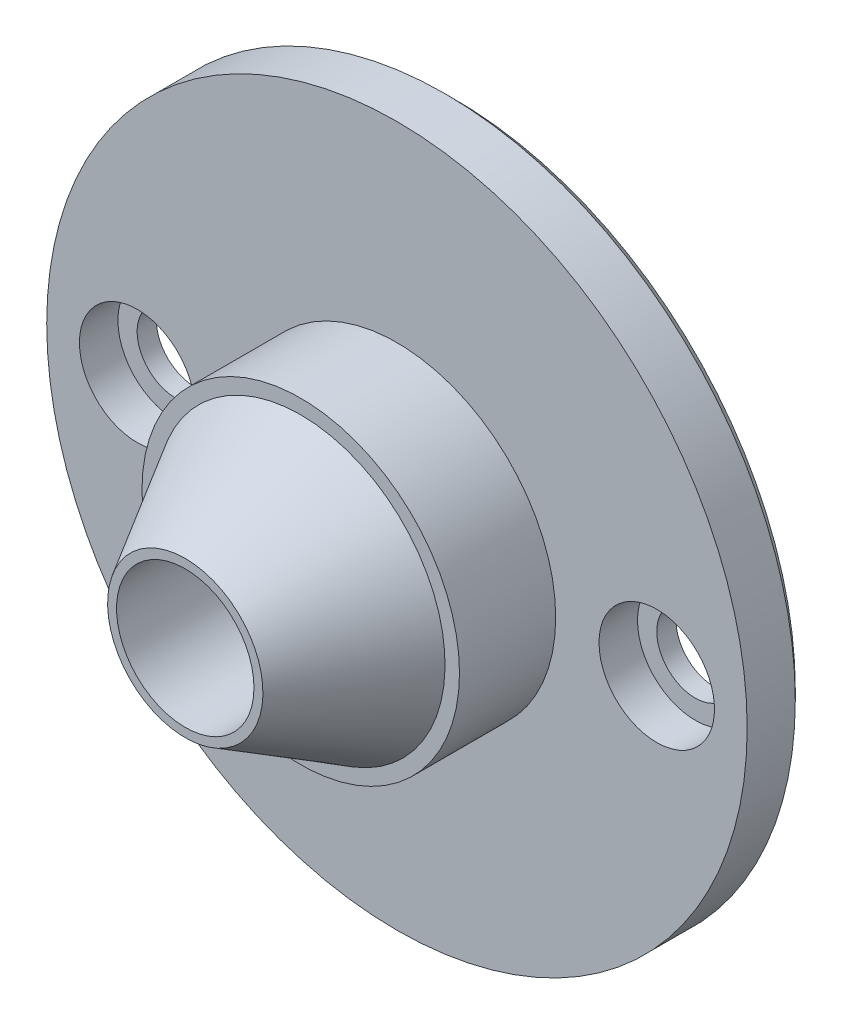
ISO-10303-21;
HEADER;
FILE_DESCRIPTION(('STEP AP214'),'2;1');
FILE_NAME('part.step','',(''),(''),'','','');
FILE_SCHEMA(('AUTOMOTIVE_DESIGN { 1 0 10303 214 1 1 1 1 }'));
ENDSEC;
DATA;
#1=APPLICATION_CONTEXT('core data for automotive mechanical design processes');
#2=APPLICATION_PROTOCOL_DEFINITION('international standard','automotive_design',2000,#1);
#3=PRODUCT_CONTEXT('',#1,'mechanical');
#4=PRODUCT('Part','Part','',(#3));
#5=PRODUCT_RELATED_PRODUCT_CATEGORY('part','',(#4));
#6=PRODUCT_DEFINITION_FORMATION('','',#4);
#7=PRODUCT_DEFINITION_CONTEXT('part definition',#1,'design');
#8=PRODUCT_DEFINITION('design','',#6,#7);
#9=PRODUCT_DEFINITION_SHAPE('','',#8);
#10=(LENGTH_UNIT() NAMED_UNIT(*) SI_UNIT(.MILLI.,.METRE.));
#11=(NAMED_UNIT(*) PLANE_ANGLE_UNIT() SI_UNIT($,.RADIAN.));
#12=(NAMED_UNIT(*) SI_UNIT($,.STERADIAN.) SOLID_ANGLE_UNIT());
#13=UNCERTAINTY_MEASURE_WITH_UNIT(LENGTH_MEASURE(1.E-05),#10,'distance_accuracy_value','');
#14=(GEOMETRIC_REPRESENTATION_CONTEXT(3) GLOBAL_UNCERTAINTY_ASSIGNED_CONTEXT((#13)) GLOBAL_UNIT_ASSIGNED_CONTEXT((#10,
#11,#12)) REPRESENTATION_CONTEXT('',''));
#15=CARTESIAN_POINT('',(0.,0.,0.));
#16=DIRECTION('',(0.,0.,1.));
#17=DIRECTION('',(1.,0.,0.));
#18=AXIS2_PLACEMENT_3D('',#15,#16,#17);
#19=CARTESIAN_POINT('',(16.536,3.036,1.));
#20=DIRECTION('',(0.,0.,1.));
#21=DIRECTION('',(-1.,0.,0.));
#22=AXIS2_PLACEMENT_3D('',#19,#20,#21);
#23=PLANE('',#22);
#24=CARTESIAN_POINT('',(13.5,0.,1.));
#25=DIRECTION('',(0.,0.,1.));
#26=DIRECTION('',(1.,0.,0.));
#27=AXIS2_PLACEMENT_3D('',#24,#25,#26);
#28=CIRCLE('',#27,2.);
#29=CARTESIAN_POINT('',(15.5,0.,1.));
#30=VERTEX_POINT('',#29);
#31=EDGE_CURVE('E19',#30,#30,#28,.T.);
#32=ORIENTED_EDGE('',*,*,#31,.F.);
#33=EDGE_LOOP('',(#32));
#34=FACE_BOUND('',#33,.T.);
#35=CARTESIAN_POINT('',(13.5,0.,1.));
#36=DIRECTION('',(0.,0.,-1.));
#37=DIRECTION('',(-1.,0.,0.));
#38=AXIS2_PLACEMENT_3D('',#35,#36,#37);
#39=CIRCLE('',#38,3.);
#40=CARTESIAN_POINT('',(10.5,0.,1.));
#41=VERTEX_POINT('',#40);
#42=EDGE_CURVE('E65',#41,#41,#39,.T.);
#43=ORIENTED_EDGE('',*,*,#42,.F.);
#44=EDGE_LOOP('',(#43));
#45=FACE_BOUND('',#44,.T.);
#46=ADVANCED_FACE('F15',(#34,#45),#23,.T.);
#47=CARTESIAN_POINT('',(-16.536,-3.036,1.));
#48=DIRECTION('',(0.,0.,1.));
#49=DIRECTION('',(1.,0.,0.));
#50=AXIS2_PLACEMENT_3D('',#47,#48,#49);
#51=PLANE('',#50);
#52=CARTESIAN_POINT('',(-13.5,0.,1.));
#53=DIRECTION('',(0.,0.,1.));
#54=DIRECTION('',(1.,0.,0.));
#55=AXIS2_PLACEMENT_3D('',#52,#53,#54);
#56=CIRCLE('',#55,2.);
#57=CARTESIAN_POINT('',(-11.5,0.,1.));
#58=VERTEX_POINT('',#57);
#59=EDGE_CURVE('E67',#58,#58,#56,.T.);
#60=ORIENTED_EDGE('',*,*,#59,.F.);
#61=EDGE_LOOP('',(#60));
#62=FACE_BOUND('',#61,.T.);
#63=CARTESIAN_POINT('',(-13.5,0.,1.));
#64=DIRECTION('',(0.,0.,-1.));
#65=DIRECTION('',(-1.,0.,0.));
#66=AXIS2_PLACEMENT_3D('',#63,#64,#65);
#67=CIRCLE('',#66,3.);
#68=CARTESIAN_POINT('',(-16.5,0.,1.));
#69=VERTEX_POINT('',#68);
#70=EDGE_CURVE('E62',#69,#69,#67,.T.);
#71=ORIENTED_EDGE('',*,*,#70,.F.);
#72=EDGE_LOOP('',(#71));
#73=FACE_BOUND('',#72,.T.);
#74=ADVANCED_FACE('F80',(#62,#73),#51,.T.);
#75=CARTESIAN_POINT('',(0.,0.,0.55000000000001));
#76=DIRECTION('',(0.,0.,1.));
#77=DIRECTION('',(1.,0.,0.));
#78=AXIS2_PLACEMENT_3D('',#75,#76,#77);
#79=CONICAL_SURFACE('',#78,18.25,0.785398163397447);
#80=CARTESIAN_POINT('',(0.,0.,0.499999999999999));
#81=DIRECTION('',(0.,0.,1.));
#82=DIRECTION('',(0.,-1.,0.));
#83=AXIS2_PLACEMENT_3D('',#80,#81,#82);
#84=CIRCLE('',#83,18.2);
#85=CARTESIAN_POINT('',(0.,-18.2,0.499999999999999));
#86=VERTEX_POINT('',#85);
#87=EDGE_CURVE('E31',#86,#86,#84,.T.);
#88=ORIENTED_EDGE('',*,*,#87,.F.);
#89=EDGE_LOOP('',(#88));
#90=FACE_BOUND('',#89,.T.);
#91=CARTESIAN_POINT('',(0.,0.,0.));
#92=DIRECTION('',(0.,0.,1.));
#93=DIRECTION('',(1.,0.,0.));
#94=AXIS2_PLACEMENT_3D('',#91,#92,#93);
#95=CIRCLE('',#94,17.7);
#96=CARTESIAN_POINT('',(17.7,0.,0.));
#97=VERTEX_POINT('',#96);
#98=EDGE_CURVE('E59',#97,#97,#95,.F.);
#99=ORIENTED_EDGE('',*,*,#98,.F.);
#100=EDGE_LOOP('',(#99));
#101=FACE_BOUND('',#100,.T.);
#102=ADVANCED_FACE('F142',(#90,#101),#79,.T.);
#103=CARTESIAN_POINT('',(13.5,0.,-0.09999999999999));
#104=DIRECTION('',(0.,0.,1.));
#105=DIRECTION('',(1.,0.,0.));
#106=AXIS2_PLACEMENT_3D('',#103,#104,#105);
#107=CYLINDRICAL_SURFACE('',#106,2.);
#108=ORIENTED_EDGE('',*,*,#31,.T.);
#109=EDGE_LOOP('',(#108));
#110=FACE_BOUND('',#109,.T.);
#111=CARTESIAN_POINT('',(13.5,0.,0.));
#112=DIRECTION('',(0.,0.,1.));
#113=DIRECTION('',(1.,0.,0.));
#114=AXIS2_PLACEMENT_3D('',#111,#112,#113);
#115=CIRCLE('',#114,2.);
#116=CARTESIAN_POINT('',(15.5,0.,0.));
#117=VERTEX_POINT('',#116);
#118=EDGE_CURVE('E56',#117,#117,#115,.T.);
#119=ORIENTED_EDGE('',*,*,#118,.F.);
#120=EDGE_LOOP('',(#119));
#121=FACE_BOUND('',#120,.T.);
#122=ADVANCED_FACE('F75',(#110,#121),#107,.F.);
#123=CARTESIAN_POINT('',(-13.5,0.,-0.09999999999999));
#124=DIRECTION('',(0.,0.,1.));
#125=DIRECTION('',(1.,0.,0.));
#126=AXIS2_PLACEMENT_3D('',#123,#124,#125);
#127=CYLINDRICAL_SURFACE('',#126,2.);
#128=CARTESIAN_POINT('',(-13.5,0.,0.));
#129=DIRECTION('',(0.,0.,1.));
#130=DIRECTION('',(1.,0.,0.));
#131=AXIS2_PLACEMENT_3D('',#128,#129,#130);
#132=CIRCLE('',#131,2.);
#133=CARTESIAN_POINT('',(-11.5,0.,0.));
#134=VERTEX_POINT('',#133);
#135=EDGE_CURVE('E53',#134,#134,#132,.T.);
#136=ORIENTED_EDGE('',*,*,#135,.F.);
#137=EDGE_LOOP('',(#136));
#138=FACE_BOUND('',#137,.T.);
#139=ORIENTED_EDGE('',*,*,#59,.T.);
#140=EDGE_LOOP('',(#139));
#141=FACE_BOUND('',#140,.T.);
#142=ADVANCED_FACE('F98',(#138,#141),#127,.F.);
#143=CARTESIAN_POINT('',(0.,0.,0.25000000000001));
#144=DIRECTION('',(0.,0.,1.));
#145=DIRECTION('',(1.,0.,0.));
#146=AXIS2_PLACEMENT_3D('',#143,#144,#145);
#147=CYLINDRICAL_SURFACE('',#146,18.2);
#148=ORIENTED_EDGE('',*,*,#87,.T.);
#149=EDGE_LOOP('',(#148));
#150=FACE_BOUND('',#149,.T.);
#151=CARTESIAN_POINT('',(0.,0.,3.));
#152=DIRECTION('',(0.,0.,1.));
#153=DIRECTION('',(1.,0.,0.));
#154=AXIS2_PLACEMENT_3D('',#151,#152,#153);
#155=CIRCLE('',#154,18.2);
#156=CARTESIAN_POINT('',(18.2,0.,3.));
#157=VERTEX_POINT('',#156);
#158=EDGE_CURVE('E50',#157,#157,#155,.T.);
#159=ORIENTED_EDGE('',*,*,#158,.F.);
#160=EDGE_LOOP('',(#159));
#161=FACE_BOUND('',#160,.T.);
#162=ADVANCED_FACE('F87',(#150,#161),#147,.T.);
#163=CARTESIAN_POINT('',(13.5,0.,3.2));
#164=DIRECTION('',(0.,0.,-1.));
#165=DIRECTION('',(-1.,0.,0.));
#166=AXIS2_PLACEMENT_3D('',#163,#164,#165);
#167=CYLINDRICAL_SURFACE('',#166,3.);
#168=CARTESIAN_POINT('',(13.5,0.,3.));
#169=DIRECTION('',(0.,0.,-1.));
#170=DIRECTION('',(-1.,0.,0.));
#171=AXIS2_PLACEMENT_3D('',#168,#169,#170);
#172=CIRCLE('',#171,3.);
#173=CARTESIAN_POINT('',(10.5,0.,3.));
#174=VERTEX_POINT('',#173);
#175=EDGE_CURVE('E47',#174,#174,#172,.T.);
#176=ORIENTED_EDGE('',*,*,#175,.F.);
#177=EDGE_LOOP('',(#176));
#178=FACE_BOUND('',#177,.T.);
#179=ORIENTED_EDGE('',*,*,#42,.T.);
#180=EDGE_LOOP('',(#179));
#181=FACE_BOUND('',#180,.T.);
#182=ADVANCED_FACE('F84',(#178,#181),#167,.F.);
#183=CARTESIAN_POINT('',(-13.5,0.,3.2));
#184=DIRECTION('',(0.,0.,-1.));
#185=DIRECTION('',(-1.,0.,0.));
#186=AXIS2_PLACEMENT_3D('',#183,#184,#185);
#187=CYLINDRICAL_SURFACE('',#186,3.);
#188=ORIENTED_EDGE('',*,*,#70,.T.);
#189=EDGE_LOOP('',(#188));
#190=FACE_BOUND('',#189,.T.);
#191=CARTESIAN_POINT('',(-13.5,0.,3.));
#192=DIRECTION('',(0.,0.,-1.));
#193=DIRECTION('',(-1.,0.,0.));
#194=AXIS2_PLACEMENT_3D('',#191,#192,#193);
#195=CIRCLE('',#194,3.);
#196=CARTESIAN_POINT('',(-16.5,0.,3.));
#197=VERTEX_POINT('',#196);
#198=EDGE_CURVE('E44',#197,#197,#195,.T.);
#199=ORIENTED_EDGE('',*,*,#198,.F.);
#200=EDGE_LOOP('',(#199));
#201=FACE_BOUND('',#200,.T.);
#202=ADVANCED_FACE('F86',(#190,#201),#187,.F.);
#203=CARTESIAN_POINT('',(17.9124,-17.9124,0.));
#204=DIRECTION('',(0.,0.,-1.));
#205=DIRECTION('',(-1.,0.,0.));
#206=AXIS2_PLACEMENT_3D('',#203,#204,#205);
#207=PLANE('',#206);
#208=CARTESIAN_POINT('',(0.,0.,0.));
#209=DIRECTION('',(0.,0.,1.));
#210=DIRECTION('',(1.,0.,0.));
#211=AXIS2_PLACEMENT_3D('',#208,#209,#210);
#212=CIRCLE('',#211,3.57);
#213=CARTESIAN_POINT('',(3.57,0.,0.));
#214=VERTEX_POINT('',#213);
#215=EDGE_CURVE('E41',#214,#214,#212,.F.);
#216=ORIENTED_EDGE('',*,*,#215,.F.);
#217=EDGE_LOOP('',(#216));
#218=FACE_BOUND('',#217,.T.);
#219=ORIENTED_EDGE('',*,*,#135,.T.);
#220=EDGE_LOOP('',(#219));
#221=FACE_BOUND('',#220,.T.);
#222=ORIENTED_EDGE('',*,*,#118,.T.);
#223=EDGE_LOOP('',(#222));
#224=FACE_BOUND('',#223,.T.);
#225=ORIENTED_EDGE('',*,*,#98,.T.);
#226=EDGE_LOOP('',(#225));
#227=FACE_BOUND('',#226,.T.);
#228=ADVANCED_FACE('F95',(#218,#221,#224,#227),#207,.T.);
#229=CARTESIAN_POINT('',(-18.4184,-18.4184,3.));
#230=DIRECTION('',(0.,0.,1.));
#231=DIRECTION('',(1.,0.,0.));
#232=AXIS2_PLACEMENT_3D('',#229,#230,#231);
#233=PLANE('',#232);
#234=CARTESIAN_POINT('',(0.,0.,3.));
#235=DIRECTION('',(0.,0.,1.));
#236=DIRECTION('',(1.,0.,0.));
#237=AXIS2_PLACEMENT_3D('',#234,#235,#236);
#238=CIRCLE('',#237,8.25);
#239=CARTESIAN_POINT('',(8.25,0.,3.));
#240=VERTEX_POINT('',#239);
#241=EDGE_CURVE('E38',#240,#240,#238,.T.);
#242=ORIENTED_EDGE('',*,*,#241,.F.);
#243=EDGE_LOOP('',(#242));
#244=FACE_BOUND('',#243,.T.);
#245=ORIENTED_EDGE('',*,*,#198,.T.);
#246=EDGE_LOOP('',(#245));
#247=FACE_BOUND('',#246,.T.);
#248=ORIENTED_EDGE('',*,*,#175,.T.);
#249=EDGE_LOOP('',(#248));
#250=FACE_BOUND('',#249,.T.);
#251=ORIENTED_EDGE('',*,*,#158,.T.);
#252=EDGE_LOOP('',(#251));
#253=FACE_BOUND('',#252,.T.);
#254=ADVANCED_FACE('F125',(#244,#247,#250,#253),#233,.T.);
#255=CARTESIAN_POINT('',(0.,0.,0.));
#256=DIRECTION('',(0.,0.,1.));
#257=DIRECTION('',(1.,0.,0.));
#258=AXIS2_PLACEMENT_3D('',#255,#256,#257);
#259=CYLINDRICAL_SURFACE('',#258,3.57);
#260=CARTESIAN_POINT('',(0.,0.,14.));
#261=DIRECTION('',(0.,0.,1.));
#262=DIRECTION('',(1.,0.,0.));
#263=AXIS2_PLACEMENT_3D('',#260,#261,#262);
#264=CIRCLE('',#263,3.57);
#265=CARTESIAN_POINT('',(3.57,0.,14.));
#266=VERTEX_POINT('',#265);
#267=EDGE_CURVE('E35',#266,#266,#264,.F.);
#268=ORIENTED_EDGE('',*,*,#267,.F.);
#269=EDGE_LOOP('',(#268));
#270=FACE_BOUND('',#269,.T.);
#271=ORIENTED_EDGE('',*,*,#215,.T.);
#272=EDGE_LOOP('',(#271));
#273=FACE_BOUND('',#272,.T.);
#274=ADVANCED_FACE('F119',(#270,#273),#259,.F.);
#275=CARTESIAN_POINT('',(0.,0.,2.5));
#276=DIRECTION('',(0.,0.,1.));
#277=DIRECTION('',(1.,0.,0.));
#278=AXIS2_PLACEMENT_3D('',#275,#276,#277);
#279=CYLINDRICAL_SURFACE('',#278,8.25);
#280=ORIENTED_EDGE('',*,*,#241,.T.);
#281=EDGE_LOOP('',(#280));
#282=FACE_BOUND('',#281,.T.);
#283=CARTESIAN_POINT('',(0.,0.,8.));
#284=DIRECTION('',(0.,0.,1.));
#285=DIRECTION('',(1.,0.,0.));
#286=AXIS2_PLACEMENT_3D('',#283,#284,#285);
#287=CIRCLE('',#286,8.25);
#288=CARTESIAN_POINT('',(8.25,0.,8.));
#289=VERTEX_POINT('',#288);
#290=EDGE_CURVE('E28',#289,#289,#287,.T.);
#291=ORIENTED_EDGE('',*,*,#290,.F.);
#292=EDGE_LOOP('',(#291));
#293=FACE_BOUND('',#292,.T.);
#294=ADVANCED_FACE('F113',(#282,#293),#279,.T.);
#295=CARTESIAN_POINT('',(-4.0843291654806,-4.0843291654806,14.));
#296=DIRECTION('',(0.,0.,1.));
#297=DIRECTION('',(1.,0.,0.));
#298=AXIS2_PLACEMENT_3D('',#295,#296,#297);
#299=PLANE('',#298);
#300=ORIENTED_EDGE('',*,*,#267,.T.);
#301=EDGE_LOOP('',(#300));
#302=FACE_BOUND('',#301,.T.);
#303=CARTESIAN_POINT('',(0.,0.,14.));
#304=DIRECTION('',(0.,0.,-1.));
#305=DIRECTION('',(0.,1.,0.));
#306=AXIS2_PLACEMENT_3D('',#303,#304,#305);
#307=CIRCLE('',#306,4.03589838486225);
#308=CARTESIAN_POINT('',(0.,4.03589838486225,14.));
#309=VERTEX_POINT('',#308);
#310=EDGE_CURVE('E23',#309,#309,#307,.T.);
#311=ORIENTED_EDGE('',*,*,#310,.F.);
#312=EDGE_LOOP('',(#311));
#313=FACE_BOUND('',#312,.T.);
#314=ADVANCED_FACE('F107',(#302,#313),#299,.T.);
#315=CARTESIAN_POINT('',(-8.349,-8.349,8.));
#316=DIRECTION('',(0.,0.,1.));
#317=DIRECTION('',(1.,0.,0.));
#318=AXIS2_PLACEMENT_3D('',#315,#316,#317);
#319=PLANE('',#318);
#320=CARTESIAN_POINT('',(0.,0.,7.99999999999999));
#321=DIRECTION('',(0.,0.,-1.));
#322=DIRECTION('',(0.,1.,0.));
#323=AXIS2_PLACEMENT_3D('',#320,#321,#322);
#324=CIRCLE('',#323,7.50000000000001);
#325=CARTESIAN_POINT('',(0.,7.50000000000001,7.99999999999999));
#326=VERTEX_POINT('',#325);
#327=EDGE_CURVE('E10',#326,#326,#324,.F.);
#328=ORIENTED_EDGE('',*,*,#327,.F.);
#329=EDGE_LOOP('',(#328));
#330=FACE_BOUND('',#329,.T.);
#331=ORIENTED_EDGE('',*,*,#290,.T.);
#332=EDGE_LOOP('',(#331));
#333=FACE_BOUND('',#332,.T.);
#334=ADVANCED_FACE('F103',(#330,#333),#319,.T.);
#335=CARTESIAN_POINT('',(0.,0.,7.40000000000001));
#336=DIRECTION('',(0.,0.,-1.));
#337=DIRECTION('',(0.,1.,0.));
#338=AXIS2_PLACEMENT_3D('',#335,#336,#337);
#339=CONICAL_SURFACE('',#338,7.84641016151378,0.523598775598299);
#340=ORIENTED_EDGE('',*,*,#327,.T.);
#341=EDGE_LOOP('',(#340));
#342=FACE_BOUND('',#341,.T.);
#343=ORIENTED_EDGE('',*,*,#310,.T.);
#344=EDGE_LOOP('',(#343));
#345=FACE_BOUND('',#344,.T.);
#346=ADVANCED_FACE('F17',(#342,#345),#339,.T.);
#347=CLOSED_SHELL('',(#46,#74,#102,#122,#142,#162,#182,#202,#228,#254,#274,#294,#314,#334,#346));
#348=MANIFOLD_SOLID_BREP('B1',#347);
#349=ADVANCED_BREP_SHAPE_REPRESENTATION('',(#18,#348),#14);
#350=SHAPE_DEFINITION_REPRESENTATION(#9,#349);
ENDSEC;
END-ISO-10303-21;
